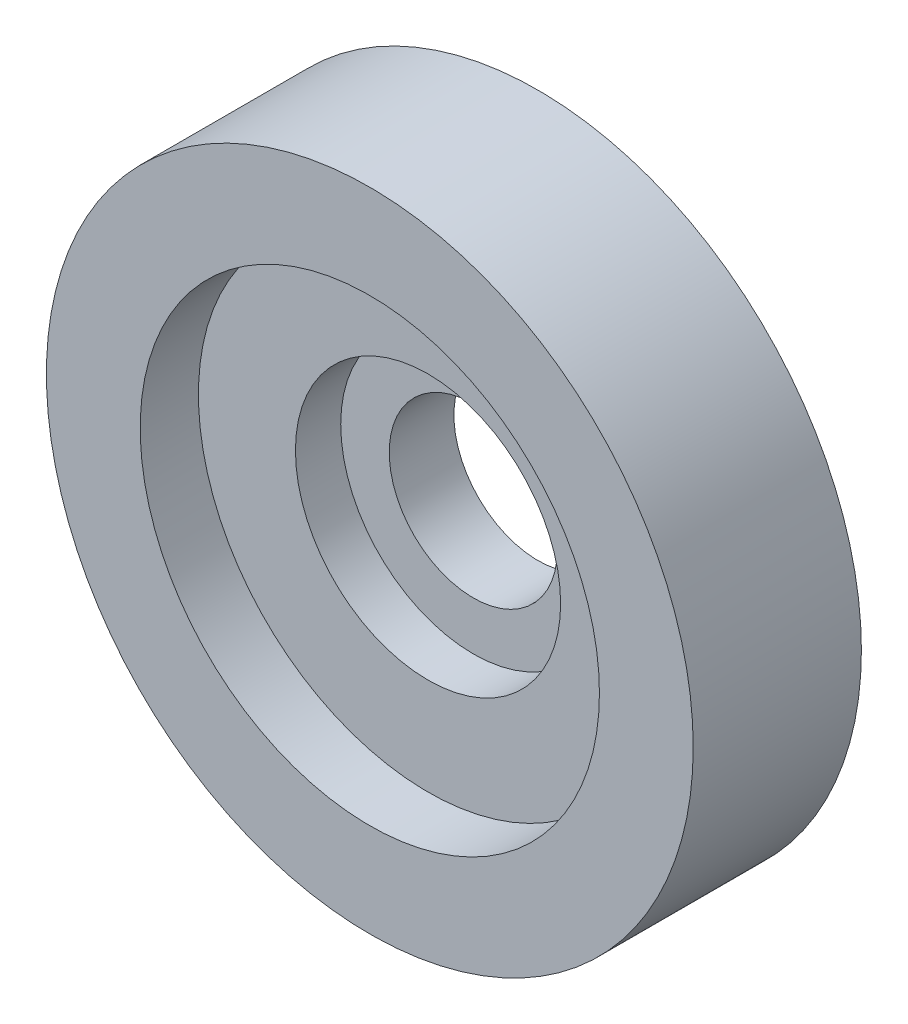
ISO-10303-21;
HEADER;
FILE_DESCRIPTION(('STEP AP214'),'2;1');
FILE_NAME('part.step','',(''),(''),'','','');
FILE_SCHEMA(('AUTOMOTIVE_DESIGN { 1 0 10303 214 1 1 1 1 }'));
ENDSEC;
DATA;
#1=APPLICATION_CONTEXT('core data for automotive mechanical design processes');
#2=APPLICATION_PROTOCOL_DEFINITION('international standard','automotive_design',2000,#1);
#3=PRODUCT_CONTEXT('',#1,'mechanical');
#4=PRODUCT('Part','Part','',(#3));
#5=PRODUCT_RELATED_PRODUCT_CATEGORY('part','',(#4));
#6=PRODUCT_DEFINITION_FORMATION('','',#4);
#7=PRODUCT_DEFINITION_CONTEXT('part definition',#1,'design');
#8=PRODUCT_DEFINITION('design','',#6,#7);
#9=PRODUCT_DEFINITION_SHAPE('','',#8);
#10=(LENGTH_UNIT() NAMED_UNIT(*) SI_UNIT(.MILLI.,.METRE.));
#11=(NAMED_UNIT(*) PLANE_ANGLE_UNIT() SI_UNIT($,.RADIAN.));
#12=(NAMED_UNIT(*) SI_UNIT($,.STERADIAN.) SOLID_ANGLE_UNIT());
#13=UNCERTAINTY_MEASURE_WITH_UNIT(LENGTH_MEASURE(1.E-05),#10,'distance_accuracy_value','');
#14=(GEOMETRIC_REPRESENTATION_CONTEXT(3) GLOBAL_UNCERTAINTY_ASSIGNED_CONTEXT((#13)) GLOBAL_UNIT_ASSIGNED_CONTEXT((#10,
#11,#12)) REPRESENTATION_CONTEXT('',''));
#15=CARTESIAN_POINT('',(0.,0.,0.));
#16=DIRECTION('',(0.,0.,1.));
#17=DIRECTION('',(1.,0.,0.));
#18=AXIS2_PLACEMENT_3D('',#15,#16,#17);
#19=CARTESIAN_POINT('',(0.,0.,-13.));
#20=DIRECTION('',(0.,0.,1.));
#21=DIRECTION('',(1.,0.,0.));
#22=AXIS2_PLACEMENT_3D('',#19,#20,#21);
#23=CYLINDRICAL_SURFACE('',#22,25.);
#24=CARTESIAN_POINT('',(0.,0.,-13.));
#25=DIRECTION('',(0.,0.,1.));
#26=DIRECTION('',(1.,0.,0.));
#27=AXIS2_PLACEMENT_3D('',#24,#25,#26);
#28=CIRCLE('',#27,25.);
#29=CARTESIAN_POINT('',(25.,0.,-13.));
#30=VERTEX_POINT('',#29);
#31=EDGE_CURVE('E10',#30,#30,#28,.T.);
#32=CARTESIAN_POINT('',(0.,0.,0.));
#33=DIRECTION('',(0.,0.,1.));
#34=DIRECTION('',(1.,0.,0.));
#35=AXIS2_PLACEMENT_3D('',#32,#33,#34);
#36=CIRCLE('',#35,25.);
#37=CARTESIAN_POINT('',(25.,0.,0.));
#38=VERTEX_POINT('',#37);
#39=EDGE_CURVE('E33',#38,#38,#36,.T.);
#40=CARTESIAN_POINT('',(25.,0.,-13.));
#41=CARTESIAN_POINT('',(25.,0.,-12.8645833333333));
#42=CARTESIAN_POINT('',(25.,0.,-12.7291666666667));
#43=CARTESIAN_POINT('',(25.,0.,-12.4583333333333));
#44=CARTESIAN_POINT('',(25.,0.,-12.3229166666667));
#45=CARTESIAN_POINT('',(25.,0.,-12.0520833333333));
#46=CARTESIAN_POINT('',(25.,0.,-11.9166666666667));
#47=CARTESIAN_POINT('',(25.,0.,-11.6458333333333));
#48=CARTESIAN_POINT('',(25.,0.,-11.5104166666667));
#49=CARTESIAN_POINT('',(25.,0.,-11.2395833333333));
#50=CARTESIAN_POINT('',(25.,0.,-11.1041666666667));
#51=CARTESIAN_POINT('',(25.,0.,-10.8333333333333));
#52=CARTESIAN_POINT('',(25.,0.,-10.6979166666667));
#53=CARTESIAN_POINT('',(25.,0.,-10.4270833333333));
#54=CARTESIAN_POINT('',(25.,0.,-10.2916666666667));
#55=CARTESIAN_POINT('',(25.,0.,-10.0208333333333));
#56=CARTESIAN_POINT('',(25.,0.,-9.88541666666667));
#57=CARTESIAN_POINT('',(25.,0.,-9.61458333333333));
#58=CARTESIAN_POINT('',(25.,0.,-9.47916666666667));
#59=CARTESIAN_POINT('',(25.,0.,-9.20833333333333));
#60=CARTESIAN_POINT('',(25.,0.,-9.07291666666667));
#61=CARTESIAN_POINT('',(25.,0.,-8.80208333333333));
#62=CARTESIAN_POINT('',(25.,0.,-8.66666666666667));
#63=CARTESIAN_POINT('',(25.,0.,-8.39583333333333));
#64=CARTESIAN_POINT('',(25.,0.,-8.26041666666667));
#65=CARTESIAN_POINT('',(25.,0.,-7.98958333333333));
#66=CARTESIAN_POINT('',(25.,0.,-7.85416666666667));
#67=CARTESIAN_POINT('',(25.,0.,-7.58333333333333));
#68=CARTESIAN_POINT('',(25.,0.,-7.44791666666667));
#69=CARTESIAN_POINT('',(25.,0.,-7.17708333333333));
#70=CARTESIAN_POINT('',(25.,0.,-7.04166666666667));
#71=CARTESIAN_POINT('',(25.,0.,-6.77083333333333));
#72=CARTESIAN_POINT('',(25.,0.,-6.63541666666667));
#73=CARTESIAN_POINT('',(25.,0.,-6.36458333333333));
#74=CARTESIAN_POINT('',(25.,0.,-6.22916666666667));
#75=CARTESIAN_POINT('',(25.,0.,-5.95833333333333));
#76=CARTESIAN_POINT('',(25.,0.,-5.82291666666667));
#77=CARTESIAN_POINT('',(25.,0.,-5.55208333333333));
#78=CARTESIAN_POINT('',(25.,0.,-5.41666666666667));
#79=CARTESIAN_POINT('',(25.,0.,-5.14583333333333));
#80=CARTESIAN_POINT('',(25.,0.,-5.01041666666667));
#81=CARTESIAN_POINT('',(25.,0.,-4.73958333333333));
#82=CARTESIAN_POINT('',(25.,0.,-4.60416666666667));
#83=CARTESIAN_POINT('',(25.,0.,-4.33333333333333));
#84=CARTESIAN_POINT('',(25.,0.,-4.19791666666667));
#85=CARTESIAN_POINT('',(25.,0.,-3.92708333333333));
#86=CARTESIAN_POINT('',(25.,0.,-3.79166666666667));
#87=CARTESIAN_POINT('',(25.,0.,-3.52083333333333));
#88=CARTESIAN_POINT('',(25.,0.,-3.38541666666667));
#89=CARTESIAN_POINT('',(25.,0.,-3.11458333333333));
#90=CARTESIAN_POINT('',(25.,0.,-2.97916666666667));
#91=CARTESIAN_POINT('',(25.,0.,-2.70833333333333));
#92=CARTESIAN_POINT('',(25.,0.,-2.57291666666667));
#93=CARTESIAN_POINT('',(25.,0.,-2.30208333333333));
#94=CARTESIAN_POINT('',(25.,0.,-2.16666666666667));
#95=CARTESIAN_POINT('',(25.,0.,-1.89583333333333));
#96=CARTESIAN_POINT('',(25.,0.,-1.76041666666667));
#97=CARTESIAN_POINT('',(25.,0.,-1.48958333333333));
#98=CARTESIAN_POINT('',(25.,0.,-1.35416666666667));
#99=CARTESIAN_POINT('',(25.,0.,-1.08333333333333));
#100=CARTESIAN_POINT('',(25.,0.,-0.947916666666667));
#101=CARTESIAN_POINT('',(25.,0.,-0.677083333333334));
#102=CARTESIAN_POINT('',(25.,0.,-0.541666666666667));
#103=CARTESIAN_POINT('',(25.,0.,-0.270833333333334));
#104=CARTESIAN_POINT('',(25.,0.,-0.135416666666667));
#105=CARTESIAN_POINT('',(25.,0.,0.));
#106=B_SPLINE_CURVE_WITH_KNOTS('',3,(#40,#41,#42,#43,#44,#45,#46,#47,#48,#49,#50,#51,#52,#53,
#54,#55,#56,#57,#58,#59,#60,#61,#62,#63,#64,#65,#66,#67,#68,#69,#70,#71,#72,#73,#74,#75,#76,#77,
#78,#79,#80,#81,#82,#83,#84,#85,#86,#87,#88,#89,#90,#91,#92,#93,#94,#95,#96,#97,#98,#99,#100,
#101,#102,#103,#104,#105),.UNSPECIFIED.,.F.,.F.,(4,2,2,2,2,2,2,2,2,2,2,2,2,2,2,2,2,2,2,2,2,2,2,
2,2,2,2,2,2,2,2,2,4),(0.,0.406249999999999,0.812499999999999,1.21875,1.625,2.03125,2.4375,
2.84375,3.25,3.65625,4.0625,4.46875,4.875,5.28125,5.6875,6.09375,6.5,6.90625,7.3125,7.71875,
8.125,8.53125,8.9375,9.34375,9.75,10.15625,10.5625,10.96875,11.375,11.78125,12.1875,12.59375,
13.),.UNSPECIFIED.);
#107=EDGE_CURVE('BSEAM30',#30,#38,#106,.T.);
#108=ORIENTED_EDGE('',*,*,#31,.T.);
#109=ORIENTED_EDGE('',*,*,#39,.F.);
#110=ORIENTED_EDGE('',*,*,#107,.T.);
#111=ORIENTED_EDGE('',*,*,#107,.F.);
#112=EDGE_LOOP('',(#108,#110,#109,#111));
#113=FACE_BOUND('',#112,.T.);
#114=ADVANCED_FACE('F30',(#113),#23,.T.);
#115=CARTESIAN_POINT('',(0.,0.,-13.));
#116=DIRECTION('',(0.,0.,1.));
#117=DIRECTION('',(1.,0.,0.));
#118=AXIS2_PLACEMENT_3D('',#115,#116,#117);
#119=PLANE('',#118);
#120=CARTESIAN_POINT('',(0.,0.,-13.));
#121=DIRECTION('',(0.,0.,1.));
#122=DIRECTION('',(1.,0.,0.));
#123=AXIS2_PLACEMENT_3D('',#120,#121,#122);
#124=CIRCLE('',#123,6.5);
#125=CARTESIAN_POINT('',(6.5,0.,-13.));
#126=VERTEX_POINT('',#125);
#127=EDGE_CURVE('E51',#126,#126,#124,.F.);
#128=ORIENTED_EDGE('',*,*,#127,.F.);
#129=EDGE_LOOP('',(#128));
#130=FACE_BOUND('',#129,.T.);
#131=ORIENTED_EDGE('',*,*,#31,.F.);
#132=EDGE_LOOP('',(#131));
#133=FACE_BOUND('',#132,.T.);
#134=ADVANCED_FACE('F90',(#130,#133),#119,.F.);
#135=CARTESIAN_POINT('',(0.,0.,0.));
#136=DIRECTION('',(0.,0.,1.));
#137=DIRECTION('',(1.,0.,0.));
#138=AXIS2_PLACEMENT_3D('',#135,#136,#137);
#139=PLANE('',#138);
#140=CARTESIAN_POINT('',(0.,0.,0.));
#141=DIRECTION('',(0.,0.,1.));
#142=DIRECTION('',(1.,0.,0.));
#143=AXIS2_PLACEMENT_3D('',#140,#141,#142);
#144=CIRCLE('',#143,17.75);
#145=CARTESIAN_POINT('',(17.75,0.,0.));
#146=VERTEX_POINT('',#145);
#147=EDGE_CURVE('E42',#146,#146,#144,.T.);
#148=ORIENTED_EDGE('',*,*,#147,.F.);
#149=EDGE_LOOP('',(#148));
#150=FACE_BOUND('',#149,.T.);
#151=ORIENTED_EDGE('',*,*,#39,.T.);
#152=EDGE_LOOP('',(#151));
#153=FACE_BOUND('',#152,.T.);
#154=ADVANCED_FACE('F84',(#150,#153),#139,.T.);
#155=CARTESIAN_POINT('',(0.,0.,-4.5));
#156=DIRECTION('',(0.,0.,1.));
#157=DIRECTION('',(1.,0.,0.));
#158=AXIS2_PLACEMENT_3D('',#155,#156,#157);
#159=CYLINDRICAL_SURFACE('',#158,17.75);
#160=CARTESIAN_POINT('',(0.,0.,-4.5));
#161=DIRECTION('',(0.,0.,1.));
#162=DIRECTION('',(1.,0.,0.));
#163=AXIS2_PLACEMENT_3D('',#160,#161,#162);
#164=CIRCLE('',#163,17.75);
#165=CARTESIAN_POINT('',(17.75,0.,-4.5));
#166=VERTEX_POINT('',#165);
#167=EDGE_CURVE('E40',#166,#166,#164,.T.);
#168=ORIENTED_EDGE('',*,*,#167,.F.);
#169=EDGE_LOOP('',(#168));
#170=FACE_BOUND('',#169,.T.);
#171=ORIENTED_EDGE('',*,*,#147,.T.);
#172=EDGE_LOOP('',(#171));
#173=FACE_BOUND('',#172,.T.);
#174=ADVANCED_FACE('F78',(#170,#173),#159,.F.);
#175=CARTESIAN_POINT('',(0.,0.,-4.5));
#176=DIRECTION('',(0.,0.,1.));
#177=DIRECTION('',(1.,0.,0.));
#178=AXIS2_PLACEMENT_3D('',#175,#176,#177);
#179=PLANE('',#178);
#180=CARTESIAN_POINT('',(0.,0.,-4.5));
#181=DIRECTION('',(0.,0.,1.));
#182=DIRECTION('',(1.,0.,0.));
#183=AXIS2_PLACEMENT_3D('',#180,#181,#182);
#184=CIRCLE('',#183,10.25);
#185=CARTESIAN_POINT('',(10.25,0.,-4.5));
#186=VERTEX_POINT('',#185);
#187=EDGE_CURVE('E48',#186,#186,#184,.T.);
#188=ORIENTED_EDGE('',*,*,#187,.F.);
#189=EDGE_LOOP('',(#188));
#190=FACE_BOUND('',#189,.T.);
#191=ORIENTED_EDGE('',*,*,#167,.T.);
#192=EDGE_LOOP('',(#191));
#193=FACE_BOUND('',#192,.T.);
#194=ADVANCED_FACE('F72',(#190,#193),#179,.T.);
#195=CARTESIAN_POINT('',(0.,0.,-8.));
#196=DIRECTION('',(0.,0.,1.));
#197=DIRECTION('',(1.,0.,0.));
#198=AXIS2_PLACEMENT_3D('',#195,#196,#197);
#199=CYLINDRICAL_SURFACE('',#198,10.25);
#200=CARTESIAN_POINT('',(0.,0.,-8.));
#201=DIRECTION('',(0.,0.,1.));
#202=DIRECTION('',(1.,0.,0.));
#203=AXIS2_PLACEMENT_3D('',#200,#201,#202);
#204=CIRCLE('',#203,10.25);
#205=CARTESIAN_POINT('',(10.25,0.,-8.));
#206=VERTEX_POINT('',#205);
#207=EDGE_CURVE('E45',#206,#206,#204,.T.);
#208=ORIENTED_EDGE('',*,*,#207,.F.);
#209=EDGE_LOOP('',(#208));
#210=FACE_BOUND('',#209,.T.);
#211=ORIENTED_EDGE('',*,*,#187,.T.);
#212=EDGE_LOOP('',(#211));
#213=FACE_BOUND('',#212,.T.);
#214=ADVANCED_FACE('F66',(#210,#213),#199,.F.);
#215=CARTESIAN_POINT('',(0.,0.,-8.));
#216=DIRECTION('',(0.,0.,1.));
#217=DIRECTION('',(1.,0.,0.));
#218=AXIS2_PLACEMENT_3D('',#215,#216,#217);
#219=PLANE('',#218);
#220=CARTESIAN_POINT('',(0.,0.,-8.));
#221=DIRECTION('',(0.,0.,1.));
#222=DIRECTION('',(1.,0.,0.));
#223=AXIS2_PLACEMENT_3D('',#220,#221,#222);
#224=CIRCLE('',#223,6.5);
#225=CARTESIAN_POINT('',(6.5,0.,-8.));
#226=VERTEX_POINT('',#225);
#227=EDGE_CURVE('E56',#226,#226,#224,.T.);
#228=ORIENTED_EDGE('',*,*,#227,.F.);
#229=EDGE_LOOP('',(#228));
#230=FACE_BOUND('',#229,.T.);
#231=ORIENTED_EDGE('',*,*,#207,.T.);
#232=EDGE_LOOP('',(#231));
#233=FACE_BOUND('',#232,.T.);
#234=ADVANCED_FACE('F63',(#230,#233),#219,.T.);
#235=CARTESIAN_POINT('',(0.,0.,-13.001));
#236=DIRECTION('',(0.,0.,1.));
#237=DIRECTION('',(1.,0.,0.));
#238=AXIS2_PLACEMENT_3D('',#235,#236,#237);
#239=CYLINDRICAL_SURFACE('',#238,6.5);
#240=ORIENTED_EDGE('',*,*,#227,.T.);
#241=EDGE_LOOP('',(#240));
#242=FACE_BOUND('',#241,.T.);
#243=ORIENTED_EDGE('',*,*,#127,.T.);
#244=EDGE_LOOP('',(#243));
#245=FACE_BOUND('',#244,.T.);
#246=ADVANCED_FACE('F60',(#242,#245),#239,.F.);
#247=CLOSED_SHELL('',(#114,#134,#154,#174,#194,#214,#234,#246));
#248=MANIFOLD_SOLID_BREP('B2',#247);
#249=ADVANCED_BREP_SHAPE_REPRESENTATION('',(#18,#248),#14);
#250=SHAPE_DEFINITION_REPRESENTATION(#9,#249);
ENDSEC;
END-ISO-10303-21;
